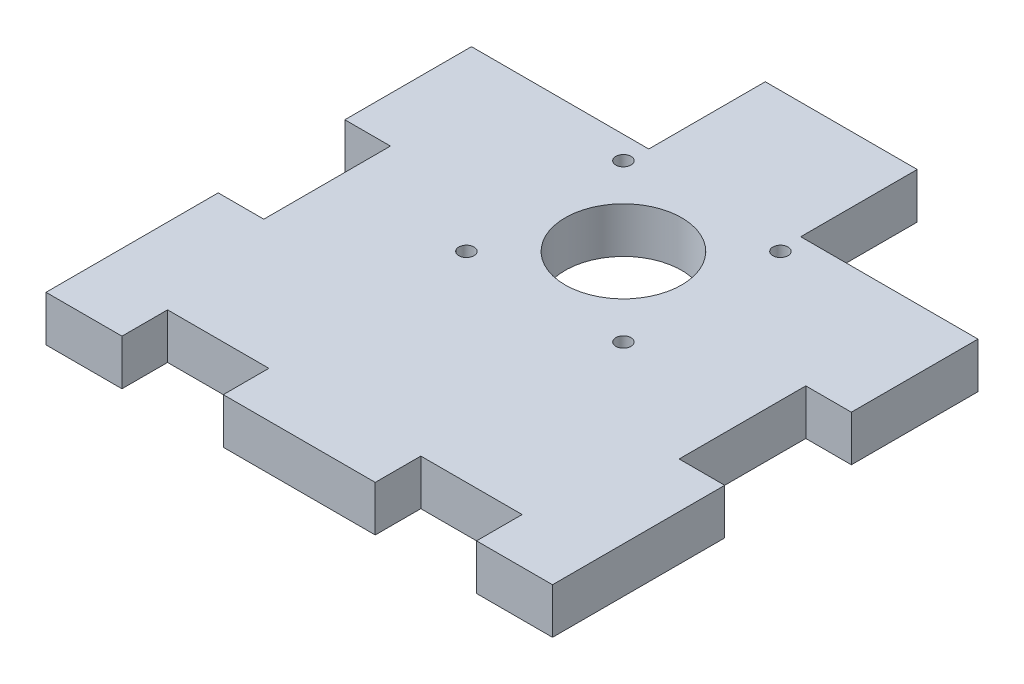
ISO-10303-21;
HEADER;
FILE_DESCRIPTION(('STEP AP214'),'2;1');
FILE_NAME('part.step','',(''),(''),'','','');
FILE_SCHEMA(('AUTOMOTIVE_DESIGN { 1 0 10303 214 1 1 1 1 }'));
ENDSEC;
DATA;
#1=APPLICATION_CONTEXT('core data for automotive mechanical design processes');
#2=APPLICATION_PROTOCOL_DEFINITION('international standard','automotive_design',2000,#1);
#3=PRODUCT_CONTEXT('',#1,'mechanical');
#4=PRODUCT('Part','Part','',(#3));
#5=PRODUCT_RELATED_PRODUCT_CATEGORY('part','',(#4));
#6=PRODUCT_DEFINITION_FORMATION('','',#4);
#7=PRODUCT_DEFINITION_CONTEXT('part definition',#1,'design');
#8=PRODUCT_DEFINITION('design','',#6,#7);
#9=PRODUCT_DEFINITION_SHAPE('','',#8);
#10=(LENGTH_UNIT() NAMED_UNIT(*) SI_UNIT(.MILLI.,.METRE.));
#11=(NAMED_UNIT(*) PLANE_ANGLE_UNIT() SI_UNIT($,.RADIAN.));
#12=(NAMED_UNIT(*) SI_UNIT($,.STERADIAN.) SOLID_ANGLE_UNIT());
#13=UNCERTAINTY_MEASURE_WITH_UNIT(LENGTH_MEASURE(1.E-05),#10,'distance_accuracy_value','');
#14=(GEOMETRIC_REPRESENTATION_CONTEXT(3) GLOBAL_UNCERTAINTY_ASSIGNED_CONTEXT((#13)) GLOBAL_UNIT_ASSIGNED_CONTEXT((#10,
#11,#12)) REPRESENTATION_CONTEXT('',''));
#15=CARTESIAN_POINT('',(0.,0.,0.));
#16=DIRECTION('',(0.,0.,1.));
#17=DIRECTION('',(1.,0.,0.));
#18=AXIS2_PLACEMENT_3D('',#15,#16,#17);
#19=CARTESIAN_POINT('',(0.,9.,0.));
#20=DIRECTION('',(0.,1.,0.));
#21=DIRECTION('',(0.,0.,1.));
#22=AXIS2_PLACEMENT_3D('',#19,#20,#21);
#23=PLANE('',#22);
#24=DIRECTION('',(0.,0.,1.));
#25=VECTOR('',#24,1.);
#26=CARTESIAN_POINT('',(50.,9.,0.));
#27=LINE('',#26,#25);
#28=CARTESIAN_POINT('',(50.,9.,-37.5));
#29=VERTEX_POINT('',#28);
#30=CARTESIAN_POINT('',(50.,9.,-12.5));
#31=VERTEX_POINT('',#30);
#32=EDGE_CURVE('E358',#29,#31,#27,.T.);
#33=ORIENTED_EDGE('',*,*,#32,.F.);
#34=DIRECTION('',(1.,0.,0.));
#35=VECTOR('',#34,1.);
#36=CARTESIAN_POINT('',(0.,9.,-37.5));
#37=LINE('',#36,#35);
#38=CARTESIAN_POINT('',(15.,9.,-37.5));
#39=VERTEX_POINT('',#38);
#40=EDGE_CURVE('E215',#39,#29,#37,.T.);
#41=ORIENTED_EDGE('',*,*,#40,.F.);
#42=DIRECTION('',(0.,0.,-1.));
#43=VECTOR('',#42,1.);
#44=CARTESIAN_POINT('',(15.,9.,0.));
#45=LINE('',#44,#43);
#46=CARTESIAN_POINT('',(15.,9.,-60.5));
#47=VERTEX_POINT('',#46);
#48=EDGE_CURVE('E311',#39,#47,#45,.T.);
#49=ORIENTED_EDGE('',*,*,#48,.T.);
#50=DIRECTION('',(1.,0.,0.));
#51=VECTOR('',#50,1.);
#52=CARTESIAN_POINT('',(0.,9.,-60.5));
#53=LINE('',#52,#51);
#54=CARTESIAN_POINT('',(-15.,9.,-60.5));
#55=VERTEX_POINT('',#54);
#56=EDGE_CURVE('E297',#55,#47,#53,.T.);
#57=ORIENTED_EDGE('',*,*,#56,.F.);
#58=DIRECTION('',(0.,0.,-1.));
#59=VECTOR('',#58,1.);
#60=CARTESIAN_POINT('',(-15.,9.,0.));
#61=LINE('',#60,#59);
#62=CARTESIAN_POINT('',(-15.,9.,-37.5));
#63=VERTEX_POINT('',#62);
#64=EDGE_CURVE('E308',#63,#55,#61,.T.);
#65=ORIENTED_EDGE('',*,*,#64,.F.);
#66=CARTESIAN_POINT('',(-50.,9.,-37.5));
#67=VERTEX_POINT('',#66);
#68=EDGE_CURVE('E313',#67,#63,#37,.T.);
#69=ORIENTED_EDGE('',*,*,#68,.F.);
#70=DIRECTION('',(0.,0.,1.));
#71=VECTOR('',#70,1.);
#72=CARTESIAN_POINT('',(-50.,9.,0.));
#73=LINE('',#72,#71);
#74=CARTESIAN_POINT('',(-50.,9.,-12.5));
#75=VERTEX_POINT('',#74);
#76=EDGE_CURVE('E64',#67,#75,#73,.T.);
#77=ORIENTED_EDGE('',*,*,#76,.T.);
#78=DIRECTION('',(1.,0.,0.));
#79=VECTOR('',#78,1.);
#80=CARTESIAN_POINT('',(0.,9.,-12.5));
#81=LINE('',#80,#79);
#82=CARTESIAN_POINT('',(-41.,9.,-12.5));
#83=VERTEX_POINT('',#82);
#84=EDGE_CURVE('E807',#75,#83,#81,.T.);
#85=ORIENTED_EDGE('',*,*,#84,.T.);
#86=DIRECTION('',(0.,0.,1.));
#87=VECTOR('',#86,1.);
#88=CARTESIAN_POINT('',(-41.,9.,0.));
#89=LINE('',#88,#87);
#90=CARTESIAN_POINT('',(-41.,9.,12.5));
#91=VERTEX_POINT('',#90);
#92=EDGE_CURVE('E806',#83,#91,#89,.T.);
#93=ORIENTED_EDGE('',*,*,#92,.T.);
#94=DIRECTION('',(1.,0.,0.));
#95=VECTOR('',#94,1.);
#96=CARTESIAN_POINT('',(0.,9.,12.5));
#97=LINE('',#96,#95);
#98=CARTESIAN_POINT('',(-50.,9.,12.5));
#99=VERTEX_POINT('',#98);
#100=EDGE_CURVE('E373',#99,#91,#97,.T.);
#101=ORIENTED_EDGE('',*,*,#100,.F.);
#102=CARTESIAN_POINT('',(-50.,9.,46.5));
#103=VERTEX_POINT('',#102);
#104=EDGE_CURVE('E320',#99,#103,#73,.T.);
#105=ORIENTED_EDGE('',*,*,#104,.T.);
#106=DIRECTION('',(1.,0.,0.));
#107=VECTOR('',#106,1.);
#108=CARTESIAN_POINT('',(0.,9.,46.5));
#109=LINE('',#108,#107);
#110=CARTESIAN_POINT('',(-35.,9.,46.5));
#111=VERTEX_POINT('',#110);
#112=EDGE_CURVE('E319',#103,#111,#109,.T.);
#113=ORIENTED_EDGE('',*,*,#112,.T.);
#114=DIRECTION('',(0.,0.,1.));
#115=VECTOR('',#114,1.);
#116=CARTESIAN_POINT('',(-35.,9.,0.));
#117=LINE('',#116,#115);
#118=CARTESIAN_POINT('',(-35.,9.,37.5));
#119=VERTEX_POINT('',#118);
#120=EDGE_CURVE('E322',#119,#111,#117,.T.);
#121=ORIENTED_EDGE('',*,*,#120,.F.);
#122=DIRECTION('',(1.,0.,0.));
#123=VECTOR('',#122,1.);
#124=CARTESIAN_POINT('',(0.,9.,37.5));
#125=LINE('',#124,#123);
#126=CARTESIAN_POINT('',(-15.,9.,37.5));
#127=VERTEX_POINT('',#126);
#128=EDGE_CURVE('E325',#119,#127,#125,.T.);
#129=ORIENTED_EDGE('',*,*,#128,.T.);
#130=DIRECTION('',(0.,0.,1.));
#131=VECTOR('',#130,1.);
#132=CARTESIAN_POINT('',(-15.,9.,0.));
#133=LINE('',#132,#131);
#134=CARTESIAN_POINT('',(-15.,9.,46.5));
#135=VERTEX_POINT('',#134);
#136=EDGE_CURVE('E327',#127,#135,#133,.T.);
#137=ORIENTED_EDGE('',*,*,#136,.T.);
#138=DIRECTION('',(1.,0.,0.));
#139=VECTOR('',#138,1.);
#140=CARTESIAN_POINT('',(0.,9.,46.5));
#141=LINE('',#140,#139);
#142=CARTESIAN_POINT('',(15.,9.,46.5));
#143=VERTEX_POINT('',#142);
#144=EDGE_CURVE('E330',#135,#143,#141,.T.);
#145=ORIENTED_EDGE('',*,*,#144,.T.);
#146=DIRECTION('',(0.,0.,1.));
#147=VECTOR('',#146,1.);
#148=CARTESIAN_POINT('',(15.,9.,0.));
#149=LINE('',#148,#147);
#150=CARTESIAN_POINT('',(15.,9.,37.5));
#151=VERTEX_POINT('',#150);
#152=EDGE_CURVE('E332',#151,#143,#149,.T.);
#153=ORIENTED_EDGE('',*,*,#152,.F.);
#154=CARTESIAN_POINT('',(35.,9.,37.5));
#155=VERTEX_POINT('',#154);
#156=EDGE_CURVE('E328',#151,#155,#125,.T.);
#157=ORIENTED_EDGE('',*,*,#156,.T.);
#158=DIRECTION('',(0.,0.,1.));
#159=VECTOR('',#158,1.);
#160=CARTESIAN_POINT('',(35.,9.,0.));
#161=LINE('',#160,#159);
#162=CARTESIAN_POINT('',(35.,9.,46.5));
#163=VERTEX_POINT('',#162);
#164=EDGE_CURVE('E334',#155,#163,#161,.T.);
#165=ORIENTED_EDGE('',*,*,#164,.T.);
#166=DIRECTION('',(-1.,0.,0.));
#167=VECTOR('',#166,1.);
#168=CARTESIAN_POINT('',(0.,9.,46.5));
#169=LINE('',#168,#167);
#170=CARTESIAN_POINT('',(50.,9.,46.5));
#171=VERTEX_POINT('',#170);
#172=EDGE_CURVE('E227',#171,#163,#169,.T.);
#173=ORIENTED_EDGE('',*,*,#172,.F.);
#174=CARTESIAN_POINT('',(50.,9.,12.5));
#175=VERTEX_POINT('',#174);
#176=EDGE_CURVE('E262',#175,#171,#27,.T.);
#177=ORIENTED_EDGE('',*,*,#176,.F.);
#178=DIRECTION('',(-1.,0.,0.));
#179=VECTOR('',#178,1.);
#180=CARTESIAN_POINT('',(0.,9.,12.5));
#181=LINE('',#180,#179);
#182=CARTESIAN_POINT('',(41.,9.,12.5));
#183=VERTEX_POINT('',#182);
#184=EDGE_CURVE('E355',#175,#183,#181,.T.);
#185=ORIENTED_EDGE('',*,*,#184,.T.);
#186=DIRECTION('',(0.,0.,1.));
#187=VECTOR('',#186,1.);
#188=CARTESIAN_POINT('',(41.,9.,0.));
#189=LINE('',#188,#187);
#190=CARTESIAN_POINT('',(41.,9.,-12.5));
#191=VERTEX_POINT('',#190);
#192=EDGE_CURVE('E818',#191,#183,#189,.T.);
#193=ORIENTED_EDGE('',*,*,#192,.F.);
#194=DIRECTION('',(-1.,0.,0.));
#195=VECTOR('',#194,1.);
#196=CARTESIAN_POINT('',(0.,9.,-12.5));
#197=LINE('',#196,#195);
#198=EDGE_CURVE('E821',#31,#191,#197,.T.);
#199=ORIENTED_EDGE('',*,*,#198,.F.);
#200=EDGE_LOOP('',(#33,#41,#49,#57,#65,#69,#77,#85,#93,#101,#105,#113,#121,#129,#137,#145,#153,
#157,#165,#173,#177,#185,#193,#199));
#201=FACE_BOUND('',#200,.T.);
#202=CARTESIAN_POINT('',(15.5,9.,-2.));
#203=DIRECTION('',(0.,-1.,0.));
#204=DIRECTION('',(0.,0.,-1.));
#205=AXIS2_PLACEMENT_3D('',#202,#203,#204);
#206=CIRCLE('',#205,1.5);
#207=CARTESIAN_POINT('',(15.5,9.,-3.5));
#208=VERTEX_POINT('',#207);
#209=EDGE_CURVE('E762',#208,#208,#206,.T.);
#210=ORIENTED_EDGE('',*,*,#209,.T.);
#211=EDGE_LOOP('',(#210));
#212=FACE_BOUND('',#211,.T.);
#213=CARTESIAN_POINT('',(-15.5,9.,-33.));
#214=DIRECTION('',(0.,-1.,0.));
#215=DIRECTION('',(0.,0.,-1.));
#216=AXIS2_PLACEMENT_3D('',#213,#214,#215);
#217=CIRCLE('',#216,1.5);
#218=CARTESIAN_POINT('',(-15.5,9.,-34.5));
#219=VERTEX_POINT('',#218);
#220=EDGE_CURVE('E779',#219,#219,#217,.T.);
#221=ORIENTED_EDGE('',*,*,#220,.T.);
#222=EDGE_LOOP('',(#221));
#223=FACE_BOUND('',#222,.T.);
#224=CARTESIAN_POINT('',(0.,9.,-17.5));
#225=DIRECTION('',(0.,1.,0.));
#226=DIRECTION('',(0.,0.,1.));
#227=AXIS2_PLACEMENT_3D('',#224,#225,#226);
#228=CIRCLE('',#227,11.5);
#229=CARTESIAN_POINT('',(0.,9.,-6.));
#230=VERTEX_POINT('',#229);
#231=EDGE_CURVE('E361',#230,#230,#228,.T.);
#232=ORIENTED_EDGE('',*,*,#231,.F.);
#233=EDGE_LOOP('',(#232));
#234=FACE_BOUND('',#233,.T.);
#235=CARTESIAN_POINT('',(15.5,9.,-33.));
#236=DIRECTION('',(0.,1.,0.));
#237=DIRECTION('',(0.,0.,1.));
#238=AXIS2_PLACEMENT_3D('',#235,#236,#237);
#239=CIRCLE('',#238,1.5);
#240=CARTESIAN_POINT('',(15.5,9.,-31.5));
#241=VERTEX_POINT('',#240);
#242=EDGE_CURVE('E773',#241,#241,#239,.T.);
#243=ORIENTED_EDGE('',*,*,#242,.F.);
#244=EDGE_LOOP('',(#243));
#245=FACE_BOUND('',#244,.T.);
#246=CARTESIAN_POINT('',(-15.5,9.,-2.));
#247=DIRECTION('',(0.,1.,0.));
#248=DIRECTION('',(0.,0.,1.));
#249=AXIS2_PLACEMENT_3D('',#246,#247,#248);
#250=CIRCLE('',#249,1.5);
#251=CARTESIAN_POINT('',(-15.5,9.,-0.499999999999997));
#252=VERTEX_POINT('',#251);
#253=EDGE_CURVE('E755',#252,#252,#250,.T.);
#254=ORIENTED_EDGE('',*,*,#253,.F.);
#255=EDGE_LOOP('',(#254));
#256=FACE_BOUND('',#255,.T.);
#257=ADVANCED_FACE('F41',(#201,#212,#223,#234,#245,#256),#23,.T.);
#258=CARTESIAN_POINT('',(0.,0.,0.));
#259=DIRECTION('',(0.,1.,0.));
#260=DIRECTION('',(0.,0.,1.));
#261=AXIS2_PLACEMENT_3D('',#258,#259,#260);
#262=PLANE('',#261);
#263=CARTESIAN_POINT('',(-15.5,0.,-2.));
#264=DIRECTION('',(0.,1.,0.));
#265=DIRECTION('',(0.,0.,1.));
#266=AXIS2_PLACEMENT_3D('',#263,#264,#265);
#267=CIRCLE('',#266,1.5);
#268=CARTESIAN_POINT('',(-15.5,0.,-0.499999999999997));
#269=VERTEX_POINT('',#268);
#270=EDGE_CURVE('E757',#269,#269,#267,.T.);
#271=ORIENTED_EDGE('',*,*,#270,.T.);
#272=EDGE_LOOP('',(#271));
#273=FACE_BOUND('',#272,.T.);
#274=CARTESIAN_POINT('',(15.5,0.,-2.));
#275=DIRECTION('',(0.,-1.,0.));
#276=DIRECTION('',(0.,0.,-1.));
#277=AXIS2_PLACEMENT_3D('',#274,#275,#276);
#278=CIRCLE('',#277,1.5);
#279=CARTESIAN_POINT('',(15.5,0.,-3.5));
#280=VERTEX_POINT('',#279);
#281=EDGE_CURVE('E770',#280,#280,#278,.T.);
#282=ORIENTED_EDGE('',*,*,#281,.F.);
#283=EDGE_LOOP('',(#282));
#284=FACE_BOUND('',#283,.T.);
#285=CARTESIAN_POINT('',(0.,0.,-17.5));
#286=DIRECTION('',(0.,1.,0.));
#287=DIRECTION('',(0.,0.,1.));
#288=AXIS2_PLACEMENT_3D('',#285,#286,#287);
#289=CIRCLE('',#288,11.5);
#290=CARTESIAN_POINT('',(0.,0.,-6.));
#291=VERTEX_POINT('',#290);
#292=EDGE_CURVE('E225',#291,#291,#289,.T.);
#293=ORIENTED_EDGE('',*,*,#292,.T.);
#294=EDGE_LOOP('',(#293));
#295=FACE_BOUND('',#294,.T.);
#296=CARTESIAN_POINT('',(-15.5,0.,-33.));
#297=DIRECTION('',(0.,-1.,0.));
#298=DIRECTION('',(0.,0.,-1.));
#299=AXIS2_PLACEMENT_3D('',#296,#297,#298);
#300=CIRCLE('',#299,1.5);
#301=CARTESIAN_POINT('',(-15.5,0.,-34.5));
#302=VERTEX_POINT('',#301);
#303=EDGE_CURVE('E782',#302,#302,#300,.T.);
#304=ORIENTED_EDGE('',*,*,#303,.F.);
#305=EDGE_LOOP('',(#304));
#306=FACE_BOUND('',#305,.T.);
#307=CARTESIAN_POINT('',(15.5,0.,-33.));
#308=DIRECTION('',(0.,1.,0.));
#309=DIRECTION('',(0.,0.,1.));
#310=AXIS2_PLACEMENT_3D('',#307,#308,#309);
#311=CIRCLE('',#310,1.5);
#312=CARTESIAN_POINT('',(15.5,0.,-31.5));
#313=VERTEX_POINT('',#312);
#314=EDGE_CURVE('E776',#313,#313,#311,.T.);
#315=ORIENTED_EDGE('',*,*,#314,.T.);
#316=EDGE_LOOP('',(#315));
#317=FACE_BOUND('',#316,.T.);
#318=DIRECTION('',(1.,0.,0.));
#319=VECTOR('',#318,1.);
#320=CARTESIAN_POINT('',(0.,0.,-37.5));
#321=LINE('',#320,#319);
#322=CARTESIAN_POINT('',(15.,0.,-37.5));
#323=VERTEX_POINT('',#322);
#324=CARTESIAN_POINT('',(50.,0.,-37.5));
#325=VERTEX_POINT('',#324);
#326=EDGE_CURVE('E202',#323,#325,#321,.T.);
#327=ORIENTED_EDGE('',*,*,#326,.T.);
#328=DIRECTION('',(0.,0.,1.));
#329=VECTOR('',#328,1.);
#330=CARTESIAN_POINT('',(50.,0.,0.));
#331=LINE('',#330,#329);
#332=CARTESIAN_POINT('',(50.,0.,-12.5));
#333=VERTEX_POINT('',#332);
#334=EDGE_CURVE('E56',#325,#333,#331,.T.);
#335=ORIENTED_EDGE('',*,*,#334,.T.);
#336=DIRECTION('',(-1.,0.,0.));
#337=VECTOR('',#336,1.);
#338=CARTESIAN_POINT('',(0.,0.,-12.5));
#339=LINE('',#338,#337);
#340=CARTESIAN_POINT('',(41.,0.,-12.5));
#341=VERTEX_POINT('',#340);
#342=EDGE_CURVE('E817',#333,#341,#339,.T.);
#343=ORIENTED_EDGE('',*,*,#342,.T.);
#344=DIRECTION('',(0.,0.,1.));
#345=VECTOR('',#344,1.);
#346=CARTESIAN_POINT('',(41.,0.,0.));
#347=LINE('',#346,#345);
#348=CARTESIAN_POINT('',(41.,0.,12.5));
#349=VERTEX_POINT('',#348);
#350=EDGE_CURVE('E825',#341,#349,#347,.T.);
#351=ORIENTED_EDGE('',*,*,#350,.T.);
#352=DIRECTION('',(-1.,0.,0.));
#353=VECTOR('',#352,1.);
#354=CARTESIAN_POINT('',(0.,0.,12.5));
#355=LINE('',#354,#353);
#356=CARTESIAN_POINT('',(50.,0.,12.5));
#357=VERTEX_POINT('',#356);
#358=EDGE_CURVE('E405',#357,#349,#355,.T.);
#359=ORIENTED_EDGE('',*,*,#358,.F.);
#360=CARTESIAN_POINT('',(50.,0.,46.5));
#361=VERTEX_POINT('',#360);
#362=EDGE_CURVE('E223',#357,#361,#331,.T.);
#363=ORIENTED_EDGE('',*,*,#362,.T.);
#364=DIRECTION('',(-1.,0.,0.));
#365=VECTOR('',#364,1.);
#366=CARTESIAN_POINT('',(0.,0.,46.5));
#367=LINE('',#366,#365);
#368=CARTESIAN_POINT('',(35.,0.,46.5));
#369=VERTEX_POINT('',#368);
#370=EDGE_CURVE('E259',#361,#369,#367,.T.);
#371=ORIENTED_EDGE('',*,*,#370,.T.);
#372=DIRECTION('',(0.,0.,1.));
#373=VECTOR('',#372,1.);
#374=CARTESIAN_POINT('',(35.,0.,0.));
#375=LINE('',#374,#373);
#376=CARTESIAN_POINT('',(35.,0.,37.5));
#377=VERTEX_POINT('',#376);
#378=EDGE_CURVE('E256',#377,#369,#375,.T.);
#379=ORIENTED_EDGE('',*,*,#378,.F.);
#380=DIRECTION('',(1.,0.,0.));
#381=VECTOR('',#380,1.);
#382=CARTESIAN_POINT('',(0.,0.,37.5));
#383=LINE('',#382,#381);
#384=CARTESIAN_POINT('',(15.,0.,37.5));
#385=VERTEX_POINT('',#384);
#386=EDGE_CURVE('E248',#385,#377,#383,.T.);
#387=ORIENTED_EDGE('',*,*,#386,.F.);
#388=DIRECTION('',(0.,0.,1.));
#389=VECTOR('',#388,1.);
#390=CARTESIAN_POINT('',(15.,0.,0.));
#391=LINE('',#390,#389);
#392=CARTESIAN_POINT('',(15.,0.,46.5));
#393=VERTEX_POINT('',#392);
#394=EDGE_CURVE('E253',#385,#393,#391,.T.);
#395=ORIENTED_EDGE('',*,*,#394,.T.);
#396=DIRECTION('',(1.,0.,0.));
#397=VECTOR('',#396,1.);
#398=CARTESIAN_POINT('',(0.,0.,46.5));
#399=LINE('',#398,#397);
#400=CARTESIAN_POINT('',(-15.,0.,46.5));
#401=VERTEX_POINT('',#400);
#402=EDGE_CURVE('E250',#401,#393,#399,.T.);
#403=ORIENTED_EDGE('',*,*,#402,.F.);
#404=DIRECTION('',(0.,0.,1.));
#405=VECTOR('',#404,1.);
#406=CARTESIAN_POINT('',(-15.,0.,0.));
#407=LINE('',#406,#405);
#408=CARTESIAN_POINT('',(-15.,0.,37.5));
#409=VERTEX_POINT('',#408);
#410=EDGE_CURVE('E247',#409,#401,#407,.T.);
#411=ORIENTED_EDGE('',*,*,#410,.F.);
#412=CARTESIAN_POINT('',(-35.,0.,37.5));
#413=VERTEX_POINT('',#412);
#414=EDGE_CURVE('E245',#413,#409,#383,.T.);
#415=ORIENTED_EDGE('',*,*,#414,.F.);
#416=DIRECTION('',(0.,0.,1.));
#417=VECTOR('',#416,1.);
#418=CARTESIAN_POINT('',(-35.,0.,0.));
#419=LINE('',#418,#417);
#420=CARTESIAN_POINT('',(-35.,0.,46.5));
#421=VERTEX_POINT('',#420);
#422=EDGE_CURVE('E242',#413,#421,#419,.T.);
#423=ORIENTED_EDGE('',*,*,#422,.T.);
#424=DIRECTION('',(1.,0.,0.));
#425=VECTOR('',#424,1.);
#426=CARTESIAN_POINT('',(0.,0.,46.5));
#427=LINE('',#426,#425);
#428=CARTESIAN_POINT('',(-50.,0.,46.5));
#429=VERTEX_POINT('',#428);
#430=EDGE_CURVE('E238',#429,#421,#427,.T.);
#431=ORIENTED_EDGE('',*,*,#430,.F.);
#432=DIRECTION('',(0.,0.,1.));
#433=VECTOR('',#432,1.);
#434=CARTESIAN_POINT('',(-50.,0.,0.));
#435=LINE('',#434,#433);
#436=CARTESIAN_POINT('',(-50.,0.,12.5));
#437=VERTEX_POINT('',#436);
#438=EDGE_CURVE('E239',#437,#429,#435,.T.);
#439=ORIENTED_EDGE('',*,*,#438,.F.);
#440=DIRECTION('',(1.,0.,0.));
#441=VECTOR('',#440,1.);
#442=CARTESIAN_POINT('',(0.,0.,12.5));
#443=LINE('',#442,#441);
#444=CARTESIAN_POINT('',(-41.,0.,12.5));
#445=VERTEX_POINT('',#444);
#446=EDGE_CURVE('E796',#437,#445,#443,.T.);
#447=ORIENTED_EDGE('',*,*,#446,.T.);
#448=DIRECTION('',(0.,0.,1.));
#449=VECTOR('',#448,1.);
#450=CARTESIAN_POINT('',(-41.,0.,0.));
#451=LINE('',#450,#449);
#452=CARTESIAN_POINT('',(-41.,0.,-12.5));
#453=VERTEX_POINT('',#452);
#454=EDGE_CURVE('E802',#453,#445,#451,.T.);
#455=ORIENTED_EDGE('',*,*,#454,.F.);
#456=DIRECTION('',(1.,0.,0.));
#457=VECTOR('',#456,1.);
#458=CARTESIAN_POINT('',(0.,0.,-12.5));
#459=LINE('',#458,#457);
#460=CARTESIAN_POINT('',(-50.,0.,-12.5));
#461=VERTEX_POINT('',#460);
#462=EDGE_CURVE('E799',#461,#453,#459,.T.);
#463=ORIENTED_EDGE('',*,*,#462,.F.);
#464=CARTESIAN_POINT('',(-50.,0.,-37.5));
#465=VERTEX_POINT('',#464);
#466=EDGE_CURVE('E236',#465,#461,#435,.T.);
#467=ORIENTED_EDGE('',*,*,#466,.F.);
#468=CARTESIAN_POINT('',(-15.,0.,-37.5));
#469=VERTEX_POINT('',#468);
#470=EDGE_CURVE('E210',#465,#469,#321,.T.);
#471=ORIENTED_EDGE('',*,*,#470,.T.);
#472=DIRECTION('',(0.,0.,-1.));
#473=VECTOR('',#472,1.);
#474=CARTESIAN_POINT('',(-15.,0.,0.));
#475=LINE('',#474,#473);
#476=CARTESIAN_POINT('',(-15.,0.,-60.5));
#477=VERTEX_POINT('',#476);
#478=EDGE_CURVE('E233',#469,#477,#475,.T.);
#479=ORIENTED_EDGE('',*,*,#478,.T.);
#480=DIRECTION('',(1.,0.,0.));
#481=VECTOR('',#480,1.);
#482=CARTESIAN_POINT('',(0.,0.,-60.5));
#483=LINE('',#482,#481);
#484=CARTESIAN_POINT('',(15.,0.,-60.5));
#485=VERTEX_POINT('',#484);
#486=EDGE_CURVE('E231',#477,#485,#483,.T.);
#487=ORIENTED_EDGE('',*,*,#486,.T.);
#488=DIRECTION('',(0.,0.,-1.));
#489=VECTOR('',#488,1.);
#490=CARTESIAN_POINT('',(15.,0.,0.));
#491=LINE('',#490,#489);
#492=EDGE_CURVE('E207',#323,#485,#491,.T.);
#493=ORIENTED_EDGE('',*,*,#492,.F.);
#494=EDGE_LOOP('',(#327,#335,#343,#351,#359,#363,#371,#379,#387,#395,#403,#411,#415,#423,#431,
#439,#447,#455,#463,#467,#471,#479,#487,#493));
#495=FACE_BOUND('',#494,.T.);
#496=ADVANCED_FACE('F204',(#273,#284,#295,#306,#317,#495),#262,.F.);
#497=CARTESIAN_POINT('',(50.,9.,0.));
#498=DIRECTION('',(1.,0.,0.));
#499=DIRECTION('',(0.,0.,-1.));
#500=AXIS2_PLACEMENT_3D('',#497,#498,#499);
#501=PLANE('',#500);
#502=ORIENTED_EDGE('',*,*,#362,.F.);
#503=DIRECTION('',(0.,1.,0.));
#504=VECTOR('',#503,1.);
#505=CARTESIAN_POINT('',(50.,0.,12.5));
#506=LINE('',#505,#504);
#507=EDGE_CURVE('E808',#357,#175,#506,.T.);
#508=ORIENTED_EDGE('',*,*,#507,.T.);
#509=ORIENTED_EDGE('',*,*,#176,.T.);
#510=DIRECTION('',(0.,-1.,0.));
#511=VECTOR('',#510,1.);
#512=CARTESIAN_POINT('',(50.,9.,46.5));
#513=LINE('',#512,#511);
#514=EDGE_CURVE('E263',#171,#361,#513,.T.);
#515=ORIENTED_EDGE('',*,*,#514,.T.);
#516=EDGE_LOOP('',(#502,#508,#509,#515));
#517=FACE_BOUND('',#516,.T.);
#518=ADVANCED_FACE('F406',(#517),#501,.T.);
#519=CARTESIAN_POINT('',(-50.,9.,0.));
#520=DIRECTION('',(1.,0.,0.));
#521=DIRECTION('',(0.,0.,-1.));
#522=AXIS2_PLACEMENT_3D('',#519,#520,#521);
#523=PLANE('',#522);
#524=ORIENTED_EDGE('',*,*,#76,.F.);
#525=DIRECTION('',(0.,1.,0.));
#526=VECTOR('',#525,1.);
#527=CARTESIAN_POINT('',(-50.,0.,-37.5));
#528=LINE('',#527,#526);
#529=EDGE_CURVE('E218',#465,#67,#528,.T.);
#530=ORIENTED_EDGE('',*,*,#529,.F.);
#531=ORIENTED_EDGE('',*,*,#466,.T.);
#532=DIRECTION('',(0.,1.,0.));
#533=VECTOR('',#532,1.);
#534=CARTESIAN_POINT('',(-50.,0.,-12.5));
#535=LINE('',#534,#533);
#536=EDGE_CURVE('E790',#461,#75,#535,.T.);
#537=ORIENTED_EDGE('',*,*,#536,.T.);
#538=EDGE_LOOP('',(#524,#530,#531,#537));
#539=FACE_BOUND('',#538,.T.);
#540=ADVANCED_FACE('F408',(#539),#523,.F.);
#541=DIRECTION('',(0.,1.,0.));
#542=VECTOR('',#541,1.);
#543=CARTESIAN_POINT('',(50.,0.,-37.5));
#544=LINE('',#543,#542);
#545=EDGE_CURVE('E212',#325,#29,#544,.T.);
#546=ORIENTED_EDGE('',*,*,#545,.T.);
#547=ORIENTED_EDGE('',*,*,#32,.T.);
#548=DIRECTION('',(0.,1.,0.));
#549=VECTOR('',#548,1.);
#550=CARTESIAN_POINT('',(50.,0.,-12.5));
#551=LINE('',#550,#549);
#552=EDGE_CURVE('E222',#333,#31,#551,.T.);
#553=ORIENTED_EDGE('',*,*,#552,.F.);
#554=ORIENTED_EDGE('',*,*,#334,.F.);
#555=EDGE_LOOP('',(#546,#547,#553,#554));
#556=FACE_BOUND('',#555,.T.);
#557=ADVANCED_FACE('F43',(#556),#501,.T.);
#558=CARTESIAN_POINT('',(0.,9.,-37.5));
#559=DIRECTION('',(0.,0.,-1.));
#560=DIRECTION('',(-1.,0.,0.));
#561=AXIS2_PLACEMENT_3D('',#558,#559,#560);
#562=PLANE('',#561);
#563=ORIENTED_EDGE('',*,*,#326,.F.);
#564=DIRECTION('',(0.,-1.,0.));
#565=VECTOR('',#564,1.);
#566=CARTESIAN_POINT('',(15.,9.,-37.5));
#567=LINE('',#566,#565);
#568=EDGE_CURVE('E11',#39,#323,#567,.T.);
#569=ORIENTED_EDGE('',*,*,#568,.F.);
#570=ORIENTED_EDGE('',*,*,#40,.T.);
#571=ORIENTED_EDGE('',*,*,#545,.F.);
#572=EDGE_LOOP('',(#563,#569,#570,#571));
#573=FACE_BOUND('',#572,.T.);
#574=ADVANCED_FACE('F213',(#573),#562,.T.);
#575=CARTESIAN_POINT('',(15.,9.,0.));
#576=DIRECTION('',(-1.,0.,0.));
#577=DIRECTION('',(0.,0.,1.));
#578=AXIS2_PLACEMENT_3D('',#575,#576,#577);
#579=PLANE('',#578);
#580=ORIENTED_EDGE('',*,*,#492,.T.);
#581=DIRECTION('',(0.,-1.,0.));
#582=VECTOR('',#581,1.);
#583=CARTESIAN_POINT('',(15.,9.,-60.5));
#584=LINE('',#583,#582);
#585=EDGE_CURVE('E49',#47,#485,#584,.T.);
#586=ORIENTED_EDGE('',*,*,#585,.F.);
#587=ORIENTED_EDGE('',*,*,#48,.F.);
#588=ORIENTED_EDGE('',*,*,#568,.T.);
#589=EDGE_LOOP('',(#580,#586,#587,#588));
#590=FACE_BOUND('',#589,.T.);
#591=ADVANCED_FACE('F300',(#590),#579,.F.);
#592=CARTESIAN_POINT('',(0.,9.,-60.5));
#593=DIRECTION('',(0.,0.,-1.));
#594=DIRECTION('',(-1.,0.,0.));
#595=AXIS2_PLACEMENT_3D('',#592,#593,#594);
#596=PLANE('',#595);
#597=ORIENTED_EDGE('',*,*,#486,.F.);
#598=DIRECTION('',(0.,-1.,0.));
#599=VECTOR('',#598,1.);
#600=CARTESIAN_POINT('',(-15.,9.,-60.5));
#601=LINE('',#600,#599);
#602=EDGE_CURVE('E290',#55,#477,#601,.T.);
#603=ORIENTED_EDGE('',*,*,#602,.F.);
#604=ORIENTED_EDGE('',*,*,#56,.T.);
#605=ORIENTED_EDGE('',*,*,#585,.T.);
#606=EDGE_LOOP('',(#597,#603,#604,#605));
#607=FACE_BOUND('',#606,.T.);
#608=ADVANCED_FACE('F295',(#607),#596,.T.);
#609=CARTESIAN_POINT('',(-15.,9.,0.));
#610=DIRECTION('',(-1.,0.,0.));
#611=DIRECTION('',(0.,0.,1.));
#612=AXIS2_PLACEMENT_3D('',#609,#610,#611);
#613=PLANE('',#612);
#614=ORIENTED_EDGE('',*,*,#478,.F.);
#615=DIRECTION('',(0.,-1.,0.));
#616=VECTOR('',#615,1.);
#617=CARTESIAN_POINT('',(-15.,9.,-37.5));
#618=LINE('',#617,#616);
#619=EDGE_CURVE('E288',#63,#469,#618,.T.);
#620=ORIENTED_EDGE('',*,*,#619,.F.);
#621=ORIENTED_EDGE('',*,*,#64,.T.);
#622=ORIENTED_EDGE('',*,*,#602,.T.);
#623=EDGE_LOOP('',(#614,#620,#621,#622));
#624=FACE_BOUND('',#623,.T.);
#625=ADVANCED_FACE('F305',(#624),#613,.T.);
#626=ORIENTED_EDGE('',*,*,#470,.F.);
#627=ORIENTED_EDGE('',*,*,#529,.T.);
#628=ORIENTED_EDGE('',*,*,#68,.T.);
#629=ORIENTED_EDGE('',*,*,#619,.T.);
#630=EDGE_LOOP('',(#626,#627,#628,#629));
#631=FACE_BOUND('',#630,.T.);
#632=ADVANCED_FACE('F443',(#631),#562,.T.);
#633=ORIENTED_EDGE('',*,*,#104,.F.);
#634=DIRECTION('',(0.,1.,0.));
#635=VECTOR('',#634,1.);
#636=CARTESIAN_POINT('',(-50.,0.,12.5));
#637=LINE('',#636,#635);
#638=EDGE_CURVE('E786',#437,#99,#637,.T.);
#639=ORIENTED_EDGE('',*,*,#638,.F.);
#640=ORIENTED_EDGE('',*,*,#438,.T.);
#641=DIRECTION('',(0.,-1.,0.));
#642=VECTOR('',#641,1.);
#643=CARTESIAN_POINT('',(-50.,9.,46.5));
#644=LINE('',#643,#642);
#645=EDGE_CURVE('E285',#103,#429,#644,.T.);
#646=ORIENTED_EDGE('',*,*,#645,.F.);
#647=EDGE_LOOP('',(#633,#639,#640,#646));
#648=FACE_BOUND('',#647,.T.);
#649=ADVANCED_FACE('F376',(#648),#523,.F.);
#650=CARTESIAN_POINT('',(0.,9.,46.5));
#651=DIRECTION('',(0.,0.,-1.));
#652=DIRECTION('',(-1.,0.,0.));
#653=AXIS2_PLACEMENT_3D('',#650,#651,#652);
#654=PLANE('',#653);
#655=ORIENTED_EDGE('',*,*,#430,.T.);
#656=DIRECTION('',(0.,-1.,0.));
#657=VECTOR('',#656,1.);
#658=CARTESIAN_POINT('',(-35.,9.,46.5));
#659=LINE('',#658,#657);
#660=EDGE_CURVE('E283',#111,#421,#659,.T.);
#661=ORIENTED_EDGE('',*,*,#660,.F.);
#662=ORIENTED_EDGE('',*,*,#112,.F.);
#663=ORIENTED_EDGE('',*,*,#645,.T.);
#664=EDGE_LOOP('',(#655,#661,#662,#663));
#665=FACE_BOUND('',#664,.T.);
#666=ADVANCED_FACE('F380',(#665),#654,.F.);
#667=CARTESIAN_POINT('',(-35.,9.,0.));
#668=DIRECTION('',(1.,0.,0.));
#669=DIRECTION('',(0.,0.,-1.));
#670=AXIS2_PLACEMENT_3D('',#667,#668,#669);
#671=PLANE('',#670);
#672=ORIENTED_EDGE('',*,*,#422,.F.);
#673=DIRECTION('',(0.,-1.,0.));
#674=VECTOR('',#673,1.);
#675=CARTESIAN_POINT('',(-35.,9.,37.5));
#676=LINE('',#675,#674);
#677=EDGE_CURVE('E281',#119,#413,#676,.T.);
#678=ORIENTED_EDGE('',*,*,#677,.F.);
#679=ORIENTED_EDGE('',*,*,#120,.T.);
#680=ORIENTED_EDGE('',*,*,#660,.T.);
#681=EDGE_LOOP('',(#672,#678,#679,#680));
#682=FACE_BOUND('',#681,.T.);
#683=ADVANCED_FACE('F383',(#682),#671,.T.);
#684=CARTESIAN_POINT('',(0.,9.,37.5));
#685=DIRECTION('',(0.,0.,-1.));
#686=DIRECTION('',(-1.,0.,0.));
#687=AXIS2_PLACEMENT_3D('',#684,#685,#686);
#688=PLANE('',#687);
#689=ORIENTED_EDGE('',*,*,#414,.T.);
#690=DIRECTION('',(0.,-1.,0.));
#691=VECTOR('',#690,1.);
#692=CARTESIAN_POINT('',(-15.,9.,37.5));
#693=LINE('',#692,#691);
#694=EDGE_CURVE('E278',#127,#409,#693,.T.);
#695=ORIENTED_EDGE('',*,*,#694,.F.);
#696=ORIENTED_EDGE('',*,*,#128,.F.);
#697=ORIENTED_EDGE('',*,*,#677,.T.);
#698=EDGE_LOOP('',(#689,#695,#696,#697));
#699=FACE_BOUND('',#698,.T.);
#700=ADVANCED_FACE('F389',(#699),#688,.F.);
#701=CARTESIAN_POINT('',(-15.,9.,0.));
#702=DIRECTION('',(1.,0.,0.));
#703=DIRECTION('',(0.,0.,-1.));
#704=AXIS2_PLACEMENT_3D('',#701,#702,#703);
#705=PLANE('',#704);
#706=ORIENTED_EDGE('',*,*,#410,.T.);
#707=DIRECTION('',(0.,-1.,0.));
#708=VECTOR('',#707,1.);
#709=CARTESIAN_POINT('',(-15.,9.,46.5));
#710=LINE('',#709,#708);
#711=EDGE_CURVE('E275',#135,#401,#710,.T.);
#712=ORIENTED_EDGE('',*,*,#711,.F.);
#713=ORIENTED_EDGE('',*,*,#136,.F.);
#714=ORIENTED_EDGE('',*,*,#694,.T.);
#715=EDGE_LOOP('',(#706,#712,#713,#714));
#716=FACE_BOUND('',#715,.T.);
#717=ADVANCED_FACE('F393',(#716),#705,.F.);
#718=CARTESIAN_POINT('',(0.,9.,46.5));
#719=DIRECTION('',(0.,0.,-1.));
#720=DIRECTION('',(-1.,0.,0.));
#721=AXIS2_PLACEMENT_3D('',#718,#719,#720);
#722=PLANE('',#721);
#723=ORIENTED_EDGE('',*,*,#402,.T.);
#724=DIRECTION('',(0.,-1.,0.));
#725=VECTOR('',#724,1.);
#726=CARTESIAN_POINT('',(15.,9.,46.5));
#727=LINE('',#726,#725);
#728=EDGE_CURVE('E273',#143,#393,#727,.T.);
#729=ORIENTED_EDGE('',*,*,#728,.F.);
#730=ORIENTED_EDGE('',*,*,#144,.F.);
#731=ORIENTED_EDGE('',*,*,#711,.T.);
#732=EDGE_LOOP('',(#723,#729,#730,#731));
#733=FACE_BOUND('',#732,.T.);
#734=ADVANCED_FACE('F398',(#733),#722,.F.);
#735=CARTESIAN_POINT('',(15.,9.,0.));
#736=DIRECTION('',(1.,0.,0.));
#737=DIRECTION('',(0.,0.,-1.));
#738=AXIS2_PLACEMENT_3D('',#735,#736,#737);
#739=PLANE('',#738);
#740=ORIENTED_EDGE('',*,*,#394,.F.);
#741=DIRECTION('',(0.,-1.,0.));
#742=VECTOR('',#741,1.);
#743=CARTESIAN_POINT('',(15.,9.,37.5));
#744=LINE('',#743,#742);
#745=EDGE_CURVE('E271',#151,#385,#744,.T.);
#746=ORIENTED_EDGE('',*,*,#745,.F.);
#747=ORIENTED_EDGE('',*,*,#152,.T.);
#748=ORIENTED_EDGE('',*,*,#728,.T.);
#749=EDGE_LOOP('',(#740,#746,#747,#748));
#750=FACE_BOUND('',#749,.T.);
#751=ADVANCED_FACE('F401',(#750),#739,.T.);
#752=ORIENTED_EDGE('',*,*,#386,.T.);
#753=DIRECTION('',(0.,-1.,0.));
#754=VECTOR('',#753,1.);
#755=CARTESIAN_POINT('',(35.,9.,37.5));
#756=LINE('',#755,#754);
#757=EDGE_CURVE('E268',#155,#377,#756,.T.);
#758=ORIENTED_EDGE('',*,*,#757,.F.);
#759=ORIENTED_EDGE('',*,*,#156,.F.);
#760=ORIENTED_EDGE('',*,*,#745,.T.);
#761=EDGE_LOOP('',(#752,#758,#759,#760));
#762=FACE_BOUND('',#761,.T.);
#763=ADVANCED_FACE('F343',(#762),#688,.F.);
#764=CARTESIAN_POINT('',(35.,9.,0.));
#765=DIRECTION('',(1.,0.,0.));
#766=DIRECTION('',(0.,0.,-1.));
#767=AXIS2_PLACEMENT_3D('',#764,#765,#766);
#768=PLANE('',#767);
#769=ORIENTED_EDGE('',*,*,#378,.T.);
#770=DIRECTION('',(0.,-1.,0.));
#771=VECTOR('',#770,1.);
#772=CARTESIAN_POINT('',(35.,9.,46.5));
#773=LINE('',#772,#771);
#774=EDGE_CURVE('E266',#163,#369,#773,.T.);
#775=ORIENTED_EDGE('',*,*,#774,.F.);
#776=ORIENTED_EDGE('',*,*,#164,.F.);
#777=ORIENTED_EDGE('',*,*,#757,.T.);
#778=EDGE_LOOP('',(#769,#775,#776,#777));
#779=FACE_BOUND('',#778,.T.);
#780=ADVANCED_FACE('F347',(#779),#768,.F.);
#781=CARTESIAN_POINT('',(0.,9.,46.5));
#782=DIRECTION('',(0.,0.,1.));
#783=DIRECTION('',(1.,0.,0.));
#784=AXIS2_PLACEMENT_3D('',#781,#782,#783);
#785=PLANE('',#784);
#786=ORIENTED_EDGE('',*,*,#370,.F.);
#787=ORIENTED_EDGE('',*,*,#514,.F.);
#788=ORIENTED_EDGE('',*,*,#172,.T.);
#789=ORIENTED_EDGE('',*,*,#774,.T.);
#790=EDGE_LOOP('',(#786,#787,#788,#789));
#791=FACE_BOUND('',#790,.T.);
#792=ADVANCED_FACE('F351',(#791),#785,.T.);
#793=CARTESIAN_POINT('',(0.,0.,-17.5));
#794=DIRECTION('',(0.,1.,0.));
#795=DIRECTION('',(0.,0.,1.));
#796=AXIS2_PLACEMENT_3D('',#793,#794,#795);
#797=CYLINDRICAL_SURFACE('',#796,11.5);
#798=ORIENTED_EDGE('',*,*,#292,.F.);
#799=EDGE_LOOP('',(#798));
#800=FACE_BOUND('',#799,.T.);
#801=ORIENTED_EDGE('',*,*,#231,.T.);
#802=EDGE_LOOP('',(#801));
#803=FACE_BOUND('',#802,.T.);
#804=ADVANCED_FACE('F423',(#800,#803),#797,.F.);
#805=CARTESIAN_POINT('',(-15.5,0.,-33.));
#806=DIRECTION('',(0.,1.,0.));
#807=DIRECTION('',(0.,0.,1.));
#808=AXIS2_PLACEMENT_3D('',#805,#806,#807);
#809=CYLINDRICAL_SURFACE('',#808,1.5);
#810=ORIENTED_EDGE('',*,*,#303,.T.);
#811=EDGE_LOOP('',(#810));
#812=FACE_BOUND('',#811,.T.);
#813=ORIENTED_EDGE('',*,*,#220,.F.);
#814=EDGE_LOOP('',(#813));
#815=FACE_BOUND('',#814,.T.);
#816=ADVANCED_FACE('F584',(#812,#815),#809,.F.);
#817=CARTESIAN_POINT('',(15.5,0.,-33.));
#818=DIRECTION('',(0.,1.,0.));
#819=DIRECTION('',(0.,0.,1.));
#820=AXIS2_PLACEMENT_3D('',#817,#818,#819);
#821=CYLINDRICAL_SURFACE('',#820,1.5);
#822=ORIENTED_EDGE('',*,*,#314,.F.);
#823=EDGE_LOOP('',(#822));
#824=FACE_BOUND('',#823,.T.);
#825=ORIENTED_EDGE('',*,*,#242,.T.);
#826=EDGE_LOOP('',(#825));
#827=FACE_BOUND('',#826,.T.);
#828=ADVANCED_FACE('F574',(#824,#827),#821,.F.);
#829=CARTESIAN_POINT('',(15.5,0.,-2.));
#830=DIRECTION('',(0.,1.,0.));
#831=DIRECTION('',(0.,0.,1.));
#832=AXIS2_PLACEMENT_3D('',#829,#830,#831);
#833=CYLINDRICAL_SURFACE('',#832,1.5);
#834=ORIENTED_EDGE('',*,*,#281,.T.);
#835=EDGE_LOOP('',(#834));
#836=FACE_BOUND('',#835,.T.);
#837=ORIENTED_EDGE('',*,*,#209,.F.);
#838=EDGE_LOOP('',(#837));
#839=FACE_BOUND('',#838,.T.);
#840=ADVANCED_FACE('F563',(#836,#839),#833,.F.);
#841=CARTESIAN_POINT('',(-15.5,0.,-2.));
#842=DIRECTION('',(0.,1.,0.));
#843=DIRECTION('',(0.,0.,1.));
#844=AXIS2_PLACEMENT_3D('',#841,#842,#843);
#845=CYLINDRICAL_SURFACE('',#844,1.5);
#846=ORIENTED_EDGE('',*,*,#270,.F.);
#847=EDGE_LOOP('',(#846));
#848=FACE_BOUND('',#847,.T.);
#849=ORIENTED_EDGE('',*,*,#253,.T.);
#850=EDGE_LOOP('',(#849));
#851=FACE_BOUND('',#850,.T.);
#852=ADVANCED_FACE('F539',(#848,#851),#845,.F.);
#853=CARTESIAN_POINT('',(-41.,0.,0.));
#854=DIRECTION('',(-1.,0.,0.));
#855=DIRECTION('',(0.,0.,1.));
#856=AXIS2_PLACEMENT_3D('',#853,#854,#855);
#857=PLANE('',#856);
#858=ORIENTED_EDGE('',*,*,#92,.F.);
#859=DIRECTION('',(0.,1.,0.));
#860=VECTOR('',#859,1.);
#861=CARTESIAN_POINT('',(-41.,0.,-12.5));
#862=LINE('',#861,#860);
#863=EDGE_CURVE('E765',#453,#83,#862,.T.);
#864=ORIENTED_EDGE('',*,*,#863,.F.);
#865=ORIENTED_EDGE('',*,*,#454,.T.);
#866=DIRECTION('',(0.,1.,0.));
#867=VECTOR('',#866,1.);
#868=CARTESIAN_POINT('',(-41.,0.,12.5));
#869=LINE('',#868,#867);
#870=EDGE_CURVE('E784',#445,#91,#869,.T.);
#871=ORIENTED_EDGE('',*,*,#870,.T.);
#872=EDGE_LOOP('',(#858,#864,#865,#871));
#873=FACE_BOUND('',#872,.T.);
#874=ADVANCED_FACE('F530',(#873),#857,.T.);
#875=CARTESIAN_POINT('',(0.,0.,12.5));
#876=DIRECTION('',(0.,0.,1.));
#877=DIRECTION('',(1.,0.,0.));
#878=AXIS2_PLACEMENT_3D('',#875,#876,#877);
#879=PLANE('',#878);
#880=ORIENTED_EDGE('',*,*,#100,.T.);
#881=ORIENTED_EDGE('',*,*,#870,.F.);
#882=ORIENTED_EDGE('',*,*,#446,.F.);
#883=ORIENTED_EDGE('',*,*,#638,.T.);
#884=EDGE_LOOP('',(#880,#881,#882,#883));
#885=FACE_BOUND('',#884,.T.);
#886=ADVANCED_FACE('F520',(#885),#879,.F.);
#887=CARTESIAN_POINT('',(0.,0.,-12.5));
#888=DIRECTION('',(0.,0.,1.));
#889=DIRECTION('',(1.,0.,0.));
#890=AXIS2_PLACEMENT_3D('',#887,#888,#889);
#891=PLANE('',#890);
#892=ORIENTED_EDGE('',*,*,#84,.F.);
#893=ORIENTED_EDGE('',*,*,#536,.F.);
#894=ORIENTED_EDGE('',*,*,#462,.T.);
#895=ORIENTED_EDGE('',*,*,#863,.T.);
#896=EDGE_LOOP('',(#892,#893,#894,#895));
#897=FACE_BOUND('',#896,.T.);
#898=ADVANCED_FACE('F510',(#897),#891,.T.);
#899=CARTESIAN_POINT('',(0.,0.,12.5));
#900=DIRECTION('',(0.,0.,-1.));
#901=DIRECTION('',(-1.,0.,0.));
#902=AXIS2_PLACEMENT_3D('',#899,#900,#901);
#903=PLANE('',#902);
#904=ORIENTED_EDGE('',*,*,#184,.F.);
#905=ORIENTED_EDGE('',*,*,#507,.F.);
#906=ORIENTED_EDGE('',*,*,#358,.T.);
#907=DIRECTION('',(0.,1.,0.));
#908=VECTOR('',#907,1.);
#909=CARTESIAN_POINT('',(41.,0.,12.5));
#910=LINE('',#909,#908);
#911=EDGE_CURVE('E813',#349,#183,#910,.T.);
#912=ORIENTED_EDGE('',*,*,#911,.T.);
#913=EDGE_LOOP('',(#904,#905,#906,#912));
#914=FACE_BOUND('',#913,.T.);
#915=ADVANCED_FACE('F500',(#914),#903,.T.);
#916=CARTESIAN_POINT('',(41.,0.,0.));
#917=DIRECTION('',(-1.,0.,0.));
#918=DIRECTION('',(0.,0.,1.));
#919=AXIS2_PLACEMENT_3D('',#916,#917,#918);
#920=PLANE('',#919);
#921=ORIENTED_EDGE('',*,*,#192,.T.);
#922=ORIENTED_EDGE('',*,*,#911,.F.);
#923=ORIENTED_EDGE('',*,*,#350,.F.);
#924=DIRECTION('',(0.,1.,0.));
#925=VECTOR('',#924,1.);
#926=CARTESIAN_POINT('',(41.,0.,-12.5));
#927=LINE('',#926,#925);
#928=EDGE_CURVE('E811',#341,#191,#927,.T.);
#929=ORIENTED_EDGE('',*,*,#928,.T.);
#930=EDGE_LOOP('',(#921,#922,#923,#929));
#931=FACE_BOUND('',#930,.T.);
#932=ADVANCED_FACE('F490',(#931),#920,.F.);
#933=CARTESIAN_POINT('',(0.,0.,-12.5));
#934=DIRECTION('',(0.,0.,-1.));
#935=DIRECTION('',(-1.,0.,0.));
#936=AXIS2_PLACEMENT_3D('',#933,#934,#935);
#937=PLANE('',#936);
#938=ORIENTED_EDGE('',*,*,#198,.T.);
#939=ORIENTED_EDGE('',*,*,#928,.F.);
#940=ORIENTED_EDGE('',*,*,#342,.F.);
#941=ORIENTED_EDGE('',*,*,#552,.T.);
#942=EDGE_LOOP('',(#938,#939,#940,#941));
#943=FACE_BOUND('',#942,.T.);
#944=ADVANCED_FACE('F485',(#943),#937,.F.);
#945=CLOSED_SHELL('',(#257,#496,#518,#540,#557,#574,#591,#608,#625,#632,#649,#666,#683,#700,
#717,#734,#751,#763,#780,#792,#804,#816,#828,#840,#852,#874,#886,#898,#915,#932,#944));
#946=MANIFOLD_SOLID_BREP('B2',#945);
#947=ADVANCED_BREP_SHAPE_REPRESENTATION('',(#18,#946),#14);
#948=SHAPE_DEFINITION_REPRESENTATION(#9,#947);
ENDSEC;
END-ISO-10303-21;
